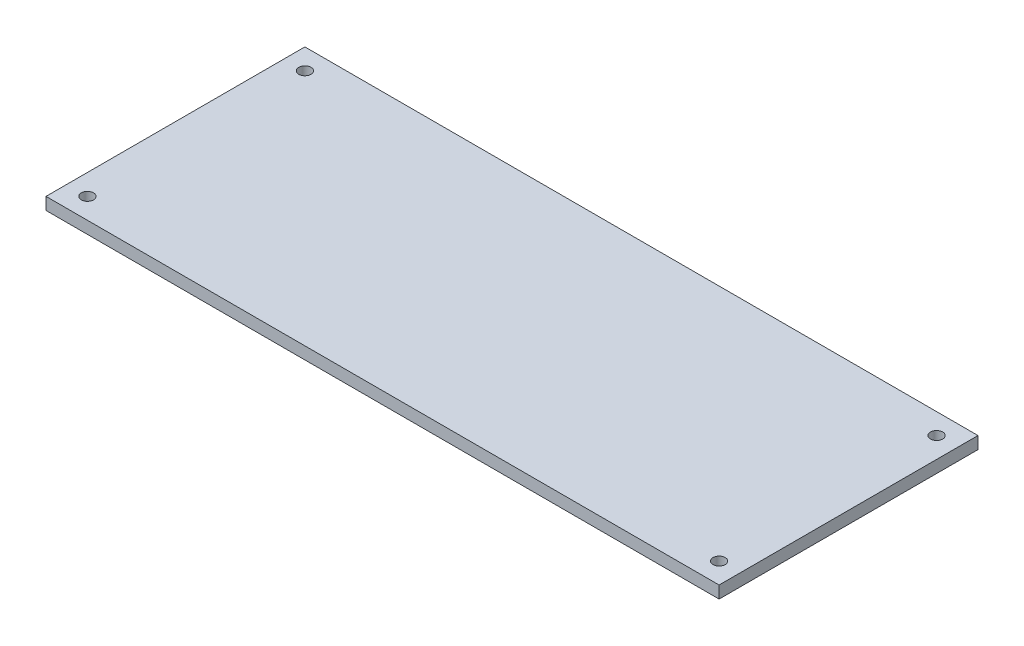
ISO-10303-21;
HEADER;
FILE_DESCRIPTION(('STEP AP214'),'2;1');
FILE_NAME('part.step','',(''),(''),'','','');
FILE_SCHEMA(('AUTOMOTIVE_DESIGN { 1 0 10303 214 1 1 1 1 }'));
ENDSEC;
DATA;
#1=APPLICATION_CONTEXT('core data for automotive mechanical design processes');
#2=APPLICATION_PROTOCOL_DEFINITION('international standard','automotive_design',2000,#1);
#3=PRODUCT_CONTEXT('',#1,'mechanical');
#4=PRODUCT('Part','Part','',(#3));
#5=PRODUCT_RELATED_PRODUCT_CATEGORY('part','',(#4));
#6=PRODUCT_DEFINITION_FORMATION('','',#4);
#7=PRODUCT_DEFINITION_CONTEXT('part definition',#1,'design');
#8=PRODUCT_DEFINITION('design','',#6,#7);
#9=PRODUCT_DEFINITION_SHAPE('','',#8);
#10=(LENGTH_UNIT() NAMED_UNIT(*) SI_UNIT(.MILLI.,.METRE.));
#11=(NAMED_UNIT(*) PLANE_ANGLE_UNIT() SI_UNIT($,.RADIAN.));
#12=(NAMED_UNIT(*) SI_UNIT($,.STERADIAN.) SOLID_ANGLE_UNIT());
#13=UNCERTAINTY_MEASURE_WITH_UNIT(LENGTH_MEASURE(1.E-05),#10,'distance_accuracy_value','');
#14=(GEOMETRIC_REPRESENTATION_CONTEXT(3) GLOBAL_UNCERTAINTY_ASSIGNED_CONTEXT((#13)) GLOBAL_UNIT_ASSIGNED_CONTEXT((#10,
#11,#12)) REPRESENTATION_CONTEXT('',''));
#15=CARTESIAN_POINT('',(0.,0.,0.));
#16=DIRECTION('',(0.,0.,1.));
#17=DIRECTION('',(1.,0.,0.));
#18=AXIS2_PLACEMENT_3D('',#15,#16,#17);
#19=CARTESIAN_POINT('',(-82.55,3.,31.75));
#20=DIRECTION('',(1.,0.,0.));
#21=DIRECTION('',(0.,0.,-1.));
#22=AXIS2_PLACEMENT_3D('',#19,#20,#21);
#23=PLANE('',#22);
#24=DIRECTION('',(0.,0.,1.));
#25=VECTOR('',#24,1.);
#26=CARTESIAN_POINT('',(-82.55,0.,31.75));
#27=LINE('',#26,#25);
#28=CARTESIAN_POINT('',(-82.55,0.,-31.75));
#29=VERTEX_POINT('',#28);
#30=CARTESIAN_POINT('',(-82.55,0.,31.75));
#31=VERTEX_POINT('',#30);
#32=EDGE_CURVE('E99',#29,#31,#27,.T.);
#33=ORIENTED_EDGE('',*,*,#32,.T.);
#34=DIRECTION('',(0.,-1.,0.));
#35=VECTOR('',#34,1.);
#36=CARTESIAN_POINT('',(-82.55,3.,31.75));
#37=LINE('',#36,#35);
#38=CARTESIAN_POINT('',(-82.55,3.,31.75));
#39=VERTEX_POINT('',#38);
#40=EDGE_CURVE('E11',#39,#31,#37,.T.);
#41=ORIENTED_EDGE('',*,*,#40,.F.);
#42=DIRECTION('',(0.,0.,1.));
#43=VECTOR('',#42,1.);
#44=CARTESIAN_POINT('',(-82.55,3.,31.75));
#45=LINE('',#44,#43);
#46=CARTESIAN_POINT('',(-82.55,3.,-31.75));
#47=VERTEX_POINT('',#46);
#48=EDGE_CURVE('E87',#47,#39,#45,.T.);
#49=ORIENTED_EDGE('',*,*,#48,.F.);
#50=DIRECTION('',(0.,-1.,0.));
#51=VECTOR('',#50,1.);
#52=CARTESIAN_POINT('',(-82.55,3.,-31.75));
#53=LINE('',#52,#51);
#54=EDGE_CURVE('E95',#47,#29,#53,.T.);
#55=ORIENTED_EDGE('',*,*,#54,.T.);
#56=EDGE_LOOP('',(#33,#41,#49,#55));
#57=FACE_BOUND('',#56,.T.);
#58=ADVANCED_FACE('F36',(#57),#23,.F.);
#59=CARTESIAN_POINT('',(-82.55,3.,31.75));
#60=DIRECTION('',(0.,0.,-1.));
#61=DIRECTION('',(-1.,0.,0.));
#62=AXIS2_PLACEMENT_3D('',#59,#60,#61);
#63=PLANE('',#62);
#64=DIRECTION('',(1.,0.,0.));
#65=VECTOR('',#64,1.);
#66=CARTESIAN_POINT('',(-82.55,0.,31.75));
#67=LINE('',#66,#65);
#68=CARTESIAN_POINT('',(82.55,0.,31.75));
#69=VERTEX_POINT('',#68);
#70=EDGE_CURVE('E91',#31,#69,#67,.T.);
#71=ORIENTED_EDGE('',*,*,#70,.T.);
#72=DIRECTION('',(0.,-1.,0.));
#73=VECTOR('',#72,1.);
#74=CARTESIAN_POINT('',(82.55,3.,31.75));
#75=LINE('',#74,#73);
#76=CARTESIAN_POINT('',(82.55,3.,31.75));
#77=VERTEX_POINT('',#76);
#78=EDGE_CURVE('E44',#77,#69,#75,.T.);
#79=ORIENTED_EDGE('',*,*,#78,.F.);
#80=DIRECTION('',(1.,0.,0.));
#81=VECTOR('',#80,1.);
#82=CARTESIAN_POINT('',(-82.55,3.,31.75));
#83=LINE('',#82,#81);
#84=EDGE_CURVE('E82',#39,#77,#83,.T.);
#85=ORIENTED_EDGE('',*,*,#84,.F.);
#86=ORIENTED_EDGE('',*,*,#40,.T.);
#87=EDGE_LOOP('',(#71,#79,#85,#86));
#88=FACE_BOUND('',#87,.T.);
#89=ADVANCED_FACE('F90',(#88),#63,.F.);
#90=CARTESIAN_POINT('',(82.55,3.,31.75));
#91=DIRECTION('',(-1.,0.,0.));
#92=DIRECTION('',(0.,0.,1.));
#93=AXIS2_PLACEMENT_3D('',#90,#91,#92);
#94=PLANE('',#93);
#95=DIRECTION('',(0.,0.,-1.));
#96=VECTOR('',#95,1.);
#97=CARTESIAN_POINT('',(82.55,0.,31.75));
#98=LINE('',#97,#96);
#99=CARTESIAN_POINT('',(82.55,0.,-31.75));
#100=VERTEX_POINT('',#99);
#101=EDGE_CURVE('E69',#69,#100,#98,.T.);
#102=ORIENTED_EDGE('',*,*,#101,.T.);
#103=DIRECTION('',(0.,-1.,0.));
#104=VECTOR('',#103,1.);
#105=CARTESIAN_POINT('',(82.55,3.,-31.75));
#106=LINE('',#105,#104);
#107=CARTESIAN_POINT('',(82.55,3.,-31.75));
#108=VERTEX_POINT('',#107);
#109=EDGE_CURVE('E92',#108,#100,#106,.T.);
#110=ORIENTED_EDGE('',*,*,#109,.F.);
#111=DIRECTION('',(0.,0.,-1.));
#112=VECTOR('',#111,1.);
#113=CARTESIAN_POINT('',(82.55,3.,31.75));
#114=LINE('',#113,#112);
#115=EDGE_CURVE('E85',#77,#108,#114,.T.);
#116=ORIENTED_EDGE('',*,*,#115,.F.);
#117=ORIENTED_EDGE('',*,*,#78,.T.);
#118=EDGE_LOOP('',(#102,#110,#116,#117));
#119=FACE_BOUND('',#118,.T.);
#120=ADVANCED_FACE('F93',(#119),#94,.F.);
#121=CARTESIAN_POINT('',(-82.55,3.,-31.75));
#122=DIRECTION('',(0.,0.,1.));
#123=DIRECTION('',(1.,0.,0.));
#124=AXIS2_PLACEMENT_3D('',#121,#122,#123);
#125=PLANE('',#124);
#126=DIRECTION('',(-1.,0.,0.));
#127=VECTOR('',#126,1.);
#128=CARTESIAN_POINT('',(-82.55,0.,-31.75));
#129=LINE('',#128,#127);
#130=EDGE_CURVE('E75',#100,#29,#129,.T.);
#131=ORIENTED_EDGE('',*,*,#130,.T.);
#132=ORIENTED_EDGE('',*,*,#54,.F.);
#133=DIRECTION('',(-1.,0.,0.));
#134=VECTOR('',#133,1.);
#135=CARTESIAN_POINT('',(-82.55,3.,-31.75));
#136=LINE('',#135,#134);
#137=EDGE_CURVE('E52',#108,#47,#136,.T.);
#138=ORIENTED_EDGE('',*,*,#137,.F.);
#139=ORIENTED_EDGE('',*,*,#109,.T.);
#140=EDGE_LOOP('',(#131,#132,#138,#139));
#141=FACE_BOUND('',#140,.T.);
#142=ADVANCED_FACE('F107',(#141),#125,.F.);
#143=CARTESIAN_POINT('',(0.,3.,0.));
#144=DIRECTION('',(0.,-1.,0.));
#145=DIRECTION('',(0.,0.,-1.));
#146=AXIS2_PLACEMENT_3D('',#143,#144,#145);
#147=PLANE('',#146);
#148=CARTESIAN_POINT('',(-77.47,3.,26.67));
#149=DIRECTION('',(0.,1.,0.));
#150=DIRECTION('',(0.,0.,1.));
#151=AXIS2_PLACEMENT_3D('',#148,#149,#150);
#152=CIRCLE('',#151,1.5);
#153=CARTESIAN_POINT('',(-77.47,3.,28.17));
#154=VERTEX_POINT('',#153);
#155=EDGE_CURVE('E116',#154,#154,#152,.T.);
#156=ORIENTED_EDGE('',*,*,#155,.F.);
#157=EDGE_LOOP('',(#156));
#158=FACE_BOUND('',#157,.T.);
#159=CARTESIAN_POINT('',(77.47,3.,-26.67));
#160=DIRECTION('',(0.,1.,0.));
#161=DIRECTION('',(0.,0.,1.));
#162=AXIS2_PLACEMENT_3D('',#159,#160,#161);
#163=CIRCLE('',#162,1.5);
#164=CARTESIAN_POINT('',(77.47,3.,-25.17));
#165=VERTEX_POINT('',#164);
#166=EDGE_CURVE('E122',#165,#165,#163,.T.);
#167=ORIENTED_EDGE('',*,*,#166,.F.);
#168=EDGE_LOOP('',(#167));
#169=FACE_BOUND('',#168,.T.);
#170=CARTESIAN_POINT('',(77.47,3.,26.67));
#171=DIRECTION('',(0.,1.,0.));
#172=DIRECTION('',(0.,0.,1.));
#173=AXIS2_PLACEMENT_3D('',#170,#171,#172);
#174=CIRCLE('',#173,1.5);
#175=CARTESIAN_POINT('',(77.47,3.,28.17));
#176=VERTEX_POINT('',#175);
#177=EDGE_CURVE('E123',#176,#176,#174,.T.);
#178=ORIENTED_EDGE('',*,*,#177,.F.);
#179=EDGE_LOOP('',(#178));
#180=FACE_BOUND('',#179,.T.);
#181=CARTESIAN_POINT('',(-77.47,3.,-26.67));
#182=DIRECTION('',(0.,1.,0.));
#183=DIRECTION('',(0.,0.,1.));
#184=AXIS2_PLACEMENT_3D('',#181,#182,#183);
#185=CIRCLE('',#184,1.5);
#186=CARTESIAN_POINT('',(-77.47,3.,-25.17));
#187=VERTEX_POINT('',#186);
#188=EDGE_CURVE('E102',#187,#187,#185,.T.);
#189=ORIENTED_EDGE('',*,*,#188,.F.);
#190=EDGE_LOOP('',(#189));
#191=FACE_BOUND('',#190,.T.);
#192=ORIENTED_EDGE('',*,*,#48,.T.);
#193=ORIENTED_EDGE('',*,*,#84,.T.);
#194=ORIENTED_EDGE('',*,*,#115,.T.);
#195=ORIENTED_EDGE('',*,*,#137,.T.);
#196=EDGE_LOOP('',(#192,#193,#194,#195));
#197=FACE_BOUND('',#196,.T.);
#198=ADVANCED_FACE('F83',(#158,#169,#180,#191,#197),#147,.F.);
#199=CARTESIAN_POINT('',(0.,0.,0.));
#200=DIRECTION('',(0.,-1.,0.));
#201=DIRECTION('',(0.,0.,-1.));
#202=AXIS2_PLACEMENT_3D('',#199,#200,#201);
#203=PLANE('',#202);
#204=CARTESIAN_POINT('',(-77.47,0.,26.67));
#205=DIRECTION('',(0.,-1.,0.));
#206=DIRECTION('',(0.,0.,-1.));
#207=AXIS2_PLACEMENT_3D('',#204,#205,#206);
#208=CIRCLE('',#207,1.5);
#209=CARTESIAN_POINT('',(-77.47,0.,28.17));
#210=VERTEX_POINT('',#209);
#211=EDGE_CURVE('E126',#210,#210,#208,.F.);
#212=ORIENTED_EDGE('',*,*,#211,.T.);
#213=EDGE_LOOP('',(#212));
#214=FACE_BOUND('',#213,.T.);
#215=CARTESIAN_POINT('',(77.47,0.,-26.67));
#216=DIRECTION('',(0.,-1.,0.));
#217=DIRECTION('',(0.,0.,-1.));
#218=AXIS2_PLACEMENT_3D('',#215,#216,#217);
#219=CIRCLE('',#218,1.5);
#220=CARTESIAN_POINT('',(77.47,0.,-25.17));
#221=VERTEX_POINT('',#220);
#222=EDGE_CURVE('E119',#221,#221,#219,.F.);
#223=ORIENTED_EDGE('',*,*,#222,.T.);
#224=EDGE_LOOP('',(#223));
#225=FACE_BOUND('',#224,.T.);
#226=CARTESIAN_POINT('',(77.47,0.,26.67));
#227=DIRECTION('',(0.,-1.,0.));
#228=DIRECTION('',(0.,0.,-1.));
#229=AXIS2_PLACEMENT_3D('',#226,#227,#228);
#230=CIRCLE('',#229,1.5);
#231=CARTESIAN_POINT('',(77.47,0.,28.17));
#232=VERTEX_POINT('',#231);
#233=EDGE_CURVE('E131',#232,#232,#230,.F.);
#234=ORIENTED_EDGE('',*,*,#233,.T.);
#235=EDGE_LOOP('',(#234));
#236=FACE_BOUND('',#235,.T.);
#237=CARTESIAN_POINT('',(-77.47,0.,-26.67));
#238=DIRECTION('',(0.,-1.,0.));
#239=DIRECTION('',(0.,0.,-1.));
#240=AXIS2_PLACEMENT_3D('',#237,#238,#239);
#241=CIRCLE('',#240,1.5);
#242=CARTESIAN_POINT('',(-77.47,0.,-25.17));
#243=VERTEX_POINT('',#242);
#244=EDGE_CURVE('E113',#243,#243,#241,.F.);
#245=ORIENTED_EDGE('',*,*,#244,.T.);
#246=EDGE_LOOP('',(#245));
#247=FACE_BOUND('',#246,.T.);
#248=ORIENTED_EDGE('',*,*,#32,.F.);
#249=ORIENTED_EDGE('',*,*,#130,.F.);
#250=ORIENTED_EDGE('',*,*,#101,.F.);
#251=ORIENTED_EDGE('',*,*,#70,.F.);
#252=EDGE_LOOP('',(#248,#249,#250,#251));
#253=FACE_BOUND('',#252,.T.);
#254=ADVANCED_FACE('F110',(#214,#225,#236,#247,#253),#203,.T.);
#255=CARTESIAN_POINT('',(-77.47,-0.00100000000000013,-26.67));
#256=DIRECTION('',(0.,1.,0.));
#257=DIRECTION('',(0.,0.,1.));
#258=AXIS2_PLACEMENT_3D('',#255,#256,#257);
#259=CYLINDRICAL_SURFACE('',#258,1.5);
#260=CARTESIAN_POINT('',(-77.47,0.,-25.17));
#261=CARTESIAN_POINT('',(-77.47,0.03125,-25.17));
#262=CARTESIAN_POINT('',(-77.47,0.0625,-25.17));
#263=CARTESIAN_POINT('',(-77.47,0.125,-25.17));
#264=CARTESIAN_POINT('',(-77.47,0.15625,-25.17));
#265=CARTESIAN_POINT('',(-77.47,0.21875,-25.17));
#266=CARTESIAN_POINT('',(-77.47,0.25,-25.17));
#267=CARTESIAN_POINT('',(-77.47,0.3125,-25.17));
#268=CARTESIAN_POINT('',(-77.47,0.34375,-25.17));
#269=CARTESIAN_POINT('',(-77.47,0.40625,-25.17));
#270=CARTESIAN_POINT('',(-77.47,0.4375,-25.17));
#271=CARTESIAN_POINT('',(-77.47,0.5,-25.17));
#272=CARTESIAN_POINT('',(-77.47,0.53125,-25.17));
#273=CARTESIAN_POINT('',(-77.47,0.59375,-25.17));
#274=CARTESIAN_POINT('',(-77.47,0.625,-25.17));
#275=CARTESIAN_POINT('',(-77.47,0.6875,-25.17));
#276=CARTESIAN_POINT('',(-77.47,0.71875,-25.17));
#277=CARTESIAN_POINT('',(-77.47,0.78125,-25.17));
#278=CARTESIAN_POINT('',(-77.47,0.8125,-25.17));
#279=CARTESIAN_POINT('',(-77.47,0.875,-25.17));
#280=CARTESIAN_POINT('',(-77.47,0.90625,-25.17));
#281=CARTESIAN_POINT('',(-77.47,0.96875,-25.17));
#282=CARTESIAN_POINT('',(-77.47,1.,-25.17));
#283=CARTESIAN_POINT('',(-77.47,1.0625,-25.17));
#284=CARTESIAN_POINT('',(-77.47,1.09375,-25.17));
#285=CARTESIAN_POINT('',(-77.47,1.15625,-25.17));
#286=CARTESIAN_POINT('',(-77.47,1.1875,-25.17));
#287=CARTESIAN_POINT('',(-77.47,1.25,-25.17));
#288=CARTESIAN_POINT('',(-77.47,1.28125,-25.17));
#289=CARTESIAN_POINT('',(-77.47,1.34375,-25.17));
#290=CARTESIAN_POINT('',(-77.47,1.375,-25.17));
#291=CARTESIAN_POINT('',(-77.47,1.4375,-25.17));
#292=CARTESIAN_POINT('',(-77.47,1.46875,-25.17));
#293=CARTESIAN_POINT('',(-77.47,1.53125,-25.17));
#294=CARTESIAN_POINT('',(-77.47,1.5625,-25.17));
#295=CARTESIAN_POINT('',(-77.47,1.625,-25.17));
#296=CARTESIAN_POINT('',(-77.47,1.65625,-25.17));
#297=CARTESIAN_POINT('',(-77.47,1.71875,-25.17));
#298=CARTESIAN_POINT('',(-77.47,1.75,-25.17));
#299=CARTESIAN_POINT('',(-77.47,1.8125,-25.17));
#300=CARTESIAN_POINT('',(-77.47,1.84375,-25.17));
#301=CARTESIAN_POINT('',(-77.47,1.90625,-25.17));
#302=CARTESIAN_POINT('',(-77.47,1.9375,-25.17));
#303=CARTESIAN_POINT('',(-77.47,2.,-25.17));
#304=CARTESIAN_POINT('',(-77.47,2.03125,-25.17));
#305=CARTESIAN_POINT('',(-77.47,2.09375,-25.17));
#306=CARTESIAN_POINT('',(-77.47,2.125,-25.17));
#307=CARTESIAN_POINT('',(-77.47,2.1875,-25.17));
#308=CARTESIAN_POINT('',(-77.47,2.21875,-25.17));
#309=CARTESIAN_POINT('',(-77.47,2.28125,-25.17));
#310=CARTESIAN_POINT('',(-77.47,2.3125,-25.17));
#311=CARTESIAN_POINT('',(-77.47,2.375,-25.17));
#312=CARTESIAN_POINT('',(-77.47,2.40625,-25.17));
#313=CARTESIAN_POINT('',(-77.47,2.46875,-25.17));
#314=CARTESIAN_POINT('',(-77.47,2.5,-25.17));
#315=CARTESIAN_POINT('',(-77.47,2.5625,-25.17));
#316=CARTESIAN_POINT('',(-77.47,2.59375,-25.17));
#317=CARTESIAN_POINT('',(-77.47,2.65625,-25.17));
#318=CARTESIAN_POINT('',(-77.47,2.6875,-25.17));
#319=CARTESIAN_POINT('',(-77.47,2.75,-25.17));
#320=CARTESIAN_POINT('',(-77.47,2.78125,-25.17));
#321=CARTESIAN_POINT('',(-77.47,2.84375,-25.17));
#322=CARTESIAN_POINT('',(-77.47,2.875,-25.17));
#323=CARTESIAN_POINT('',(-77.47,2.9375,-25.17));
#324=CARTESIAN_POINT('',(-77.47,2.96875,-25.17));
#325=CARTESIAN_POINT('',(-77.47,3.,-25.17));
#326=B_SPLINE_CURVE_WITH_KNOTS('',3,(#260,#261,#262,#263,#264,#265,#266,#267,#268,#269,#270,
#271,#272,#273,#274,#275,#276,#277,#278,#279,#280,#281,#282,#283,#284,#285,#286,#287,#288,#289,
#290,#291,#292,#293,#294,#295,#296,#297,#298,#299,#300,#301,#302,#303,#304,#305,#306,#307,#308,
#309,#310,#311,#312,#313,#314,#315,#316,#317,#318,#319,#320,#321,#322,#323,#324,#325),
.UNSPECIFIED.,.F.,.F.,(4,2,2,2,2,2,2,2,2,2,2,2,2,2,2,2,2,2,2,2,2,2,2,2,2,2,2,2,2,2,2,2,4),(0.,
0.09375,0.1875,0.28125,0.375,0.46875,0.5625,0.65625,0.75,0.84375,0.9375,1.03125,1.125,1.21875,
1.3125,1.40625,1.5,1.59375,1.6875,1.78125,1.875,1.96875,2.0625,2.15625,2.25,2.34375,2.4375,
2.53125,2.625,2.71875,2.8125,2.90625,3.),.UNSPECIFIED.);
#327=EDGE_CURVE('BSEAM145',#243,#187,#326,.T.);
#328=ORIENTED_EDGE('',*,*,#244,.F.);
#329=ORIENTED_EDGE('',*,*,#188,.T.);
#330=ORIENTED_EDGE('',*,*,#327,.T.);
#331=ORIENTED_EDGE('',*,*,#327,.F.);
#332=EDGE_LOOP('',(#328,#330,#329,#331));
#333=FACE_BOUND('',#332,.T.);
#334=ADVANCED_FACE('F145',(#333),#259,.F.);
#335=CARTESIAN_POINT('',(77.47,-0.00100000000000013,26.67));
#336=DIRECTION('',(0.,1.,0.));
#337=DIRECTION('',(0.,0.,1.));
#338=AXIS2_PLACEMENT_3D('',#335,#336,#337);
#339=CYLINDRICAL_SURFACE('',#338,1.5);
#340=CARTESIAN_POINT('',(77.47,0.,28.17));
#341=CARTESIAN_POINT('',(77.47,0.03125,28.17));
#342=CARTESIAN_POINT('',(77.47,0.0625,28.17));
#343=CARTESIAN_POINT('',(77.47,0.125,28.17));
#344=CARTESIAN_POINT('',(77.47,0.15625,28.17));
#345=CARTESIAN_POINT('',(77.47,0.21875,28.17));
#346=CARTESIAN_POINT('',(77.47,0.25,28.17));
#347=CARTESIAN_POINT('',(77.47,0.3125,28.17));
#348=CARTESIAN_POINT('',(77.47,0.34375,28.17));
#349=CARTESIAN_POINT('',(77.47,0.40625,28.17));
#350=CARTESIAN_POINT('',(77.47,0.4375,28.17));
#351=CARTESIAN_POINT('',(77.47,0.5,28.17));
#352=CARTESIAN_POINT('',(77.47,0.53125,28.17));
#353=CARTESIAN_POINT('',(77.47,0.59375,28.17));
#354=CARTESIAN_POINT('',(77.47,0.625,28.17));
#355=CARTESIAN_POINT('',(77.47,0.6875,28.17));
#356=CARTESIAN_POINT('',(77.47,0.71875,28.17));
#357=CARTESIAN_POINT('',(77.47,0.78125,28.17));
#358=CARTESIAN_POINT('',(77.47,0.8125,28.17));
#359=CARTESIAN_POINT('',(77.47,0.875,28.17));
#360=CARTESIAN_POINT('',(77.47,0.90625,28.17));
#361=CARTESIAN_POINT('',(77.47,0.96875,28.17));
#362=CARTESIAN_POINT('',(77.47,1.,28.17));
#363=CARTESIAN_POINT('',(77.47,1.0625,28.17));
#364=CARTESIAN_POINT('',(77.47,1.09375,28.17));
#365=CARTESIAN_POINT('',(77.47,1.15625,28.17));
#366=CARTESIAN_POINT('',(77.47,1.1875,28.17));
#367=CARTESIAN_POINT('',(77.47,1.25,28.17));
#368=CARTESIAN_POINT('',(77.47,1.28125,28.17));
#369=CARTESIAN_POINT('',(77.47,1.34375,28.17));
#370=CARTESIAN_POINT('',(77.47,1.375,28.17));
#371=CARTESIAN_POINT('',(77.47,1.4375,28.17));
#372=CARTESIAN_POINT('',(77.47,1.46875,28.17));
#373=CARTESIAN_POINT('',(77.47,1.53125,28.17));
#374=CARTESIAN_POINT('',(77.47,1.5625,28.17));
#375=CARTESIAN_POINT('',(77.47,1.625,28.17));
#376=CARTESIAN_POINT('',(77.47,1.65625,28.17));
#377=CARTESIAN_POINT('',(77.47,1.71875,28.17));
#378=CARTESIAN_POINT('',(77.47,1.75,28.17));
#379=CARTESIAN_POINT('',(77.47,1.8125,28.17));
#380=CARTESIAN_POINT('',(77.47,1.84375,28.17));
#381=CARTESIAN_POINT('',(77.47,1.90625,28.17));
#382=CARTESIAN_POINT('',(77.47,1.9375,28.17));
#383=CARTESIAN_POINT('',(77.47,2.,28.17));
#384=CARTESIAN_POINT('',(77.47,2.03125,28.17));
#385=CARTESIAN_POINT('',(77.47,2.09375,28.17));
#386=CARTESIAN_POINT('',(77.47,2.125,28.17));
#387=CARTESIAN_POINT('',(77.47,2.1875,28.17));
#388=CARTESIAN_POINT('',(77.47,2.21875,28.17));
#389=CARTESIAN_POINT('',(77.47,2.28125,28.17));
#390=CARTESIAN_POINT('',(77.47,2.3125,28.17));
#391=CARTESIAN_POINT('',(77.47,2.375,28.17));
#392=CARTESIAN_POINT('',(77.47,2.40625,28.17));
#393=CARTESIAN_POINT('',(77.47,2.46875,28.17));
#394=CARTESIAN_POINT('',(77.47,2.5,28.17));
#395=CARTESIAN_POINT('',(77.47,2.5625,28.17));
#396=CARTESIAN_POINT('',(77.47,2.59375,28.17));
#397=CARTESIAN_POINT('',(77.47,2.65625,28.17));
#398=CARTESIAN_POINT('',(77.47,2.6875,28.17));
#399=CARTESIAN_POINT('',(77.47,2.75,28.17));
#400=CARTESIAN_POINT('',(77.47,2.78125,28.17));
#401=CARTESIAN_POINT('',(77.47,2.84375,28.17));
#402=CARTESIAN_POINT('',(77.47,2.875,28.17));
#403=CARTESIAN_POINT('',(77.47,2.9375,28.17));
#404=CARTESIAN_POINT('',(77.47,2.96875,28.17));
#405=CARTESIAN_POINT('',(77.47,3.,28.17));
#406=B_SPLINE_CURVE_WITH_KNOTS('',3,(#340,#341,#342,#343,#344,#345,#346,#347,#348,#349,#350,
#351,#352,#353,#354,#355,#356,#357,#358,#359,#360,#361,#362,#363,#364,#365,#366,#367,#368,#369,
#370,#371,#372,#373,#374,#375,#376,#377,#378,#379,#380,#381,#382,#383,#384,#385,#386,#387,#388,
#389,#390,#391,#392,#393,#394,#395,#396,#397,#398,#399,#400,#401,#402,#403,#404,#405),
.UNSPECIFIED.,.F.,.F.,(4,2,2,2,2,2,2,2,2,2,2,2,2,2,2,2,2,2,2,2,2,2,2,2,2,2,2,2,2,2,2,2,4),(0.,
0.09375,0.1875,0.28125,0.375,0.46875,0.5625,0.65625,0.75,0.84375,0.9375,1.03125,1.125,1.21875,
1.3125,1.40625,1.5,1.59375,1.6875,1.78125,1.875,1.96875,2.0625,2.15625,2.25,2.34375,2.4375,
2.53125,2.625,2.71875,2.8125,2.90625,3.),.UNSPECIFIED.);
#407=EDGE_CURVE('BSEAM137',#232,#176,#406,.T.);
#408=ORIENTED_EDGE('',*,*,#233,.F.);
#409=ORIENTED_EDGE('',*,*,#177,.T.);
#410=ORIENTED_EDGE('',*,*,#407,.T.);
#411=ORIENTED_EDGE('',*,*,#407,.F.);
#412=EDGE_LOOP('',(#408,#410,#409,#411));
#413=FACE_BOUND('',#412,.T.);
#414=ADVANCED_FACE('F137',(#413),#339,.F.);
#415=CARTESIAN_POINT('',(77.47,-0.00100000000000013,-26.67));
#416=DIRECTION('',(0.,1.,0.));
#417=DIRECTION('',(0.,0.,1.));
#418=AXIS2_PLACEMENT_3D('',#415,#416,#417);
#419=CYLINDRICAL_SURFACE('',#418,1.5);
#420=CARTESIAN_POINT('',(77.47,0.,-25.17));
#421=CARTESIAN_POINT('',(77.47,0.03125,-25.17));
#422=CARTESIAN_POINT('',(77.47,0.0625,-25.17));
#423=CARTESIAN_POINT('',(77.47,0.125,-25.17));
#424=CARTESIAN_POINT('',(77.47,0.15625,-25.17));
#425=CARTESIAN_POINT('',(77.47,0.21875,-25.17));
#426=CARTESIAN_POINT('',(77.47,0.25,-25.17));
#427=CARTESIAN_POINT('',(77.47,0.3125,-25.17));
#428=CARTESIAN_POINT('',(77.47,0.34375,-25.17));
#429=CARTESIAN_POINT('',(77.47,0.40625,-25.17));
#430=CARTESIAN_POINT('',(77.47,0.4375,-25.17));
#431=CARTESIAN_POINT('',(77.47,0.5,-25.17));
#432=CARTESIAN_POINT('',(77.47,0.53125,-25.17));
#433=CARTESIAN_POINT('',(77.47,0.59375,-25.17));
#434=CARTESIAN_POINT('',(77.47,0.625,-25.17));
#435=CARTESIAN_POINT('',(77.47,0.6875,-25.17));
#436=CARTESIAN_POINT('',(77.47,0.71875,-25.17));
#437=CARTESIAN_POINT('',(77.47,0.78125,-25.17));
#438=CARTESIAN_POINT('',(77.47,0.8125,-25.17));
#439=CARTESIAN_POINT('',(77.47,0.875,-25.17));
#440=CARTESIAN_POINT('',(77.47,0.90625,-25.17));
#441=CARTESIAN_POINT('',(77.47,0.96875,-25.17));
#442=CARTESIAN_POINT('',(77.47,1.,-25.17));
#443=CARTESIAN_POINT('',(77.47,1.0625,-25.17));
#444=CARTESIAN_POINT('',(77.47,1.09375,-25.17));
#445=CARTESIAN_POINT('',(77.47,1.15625,-25.17));
#446=CARTESIAN_POINT('',(77.47,1.1875,-25.17));
#447=CARTESIAN_POINT('',(77.47,1.25,-25.17));
#448=CARTESIAN_POINT('',(77.47,1.28125,-25.17));
#449=CARTESIAN_POINT('',(77.47,1.34375,-25.17));
#450=CARTESIAN_POINT('',(77.47,1.375,-25.17));
#451=CARTESIAN_POINT('',(77.47,1.4375,-25.17));
#452=CARTESIAN_POINT('',(77.47,1.46875,-25.17));
#453=CARTESIAN_POINT('',(77.47,1.53125,-25.17));
#454=CARTESIAN_POINT('',(77.47,1.5625,-25.17));
#455=CARTESIAN_POINT('',(77.47,1.625,-25.17));
#456=CARTESIAN_POINT('',(77.47,1.65625,-25.17));
#457=CARTESIAN_POINT('',(77.47,1.71875,-25.17));
#458=CARTESIAN_POINT('',(77.47,1.75,-25.17));
#459=CARTESIAN_POINT('',(77.47,1.8125,-25.17));
#460=CARTESIAN_POINT('',(77.47,1.84375,-25.17));
#461=CARTESIAN_POINT('',(77.47,1.90625,-25.17));
#462=CARTESIAN_POINT('',(77.47,1.9375,-25.17));
#463=CARTESIAN_POINT('',(77.47,2.,-25.17));
#464=CARTESIAN_POINT('',(77.47,2.03125,-25.17));
#465=CARTESIAN_POINT('',(77.47,2.09375,-25.17));
#466=CARTESIAN_POINT('',(77.47,2.125,-25.17));
#467=CARTESIAN_POINT('',(77.47,2.1875,-25.17));
#468=CARTESIAN_POINT('',(77.47,2.21875,-25.17));
#469=CARTESIAN_POINT('',(77.47,2.28125,-25.17));
#470=CARTESIAN_POINT('',(77.47,2.3125,-25.17));
#471=CARTESIAN_POINT('',(77.47,2.375,-25.17));
#472=CARTESIAN_POINT('',(77.47,2.40625,-25.17));
#473=CARTESIAN_POINT('',(77.47,2.46875,-25.17));
#474=CARTESIAN_POINT('',(77.47,2.5,-25.17));
#475=CARTESIAN_POINT('',(77.47,2.5625,-25.17));
#476=CARTESIAN_POINT('',(77.47,2.59375,-25.17));
#477=CARTESIAN_POINT('',(77.47,2.65625,-25.17));
#478=CARTESIAN_POINT('',(77.47,2.6875,-25.17));
#479=CARTESIAN_POINT('',(77.47,2.75,-25.17));
#480=CARTESIAN_POINT('',(77.47,2.78125,-25.17));
#481=CARTESIAN_POINT('',(77.47,2.84375,-25.17));
#482=CARTESIAN_POINT('',(77.47,2.875,-25.17));
#483=CARTESIAN_POINT('',(77.47,2.9375,-25.17));
#484=CARTESIAN_POINT('',(77.47,2.96875,-25.17));
#485=CARTESIAN_POINT('',(77.47,3.,-25.17));
#486=B_SPLINE_CURVE_WITH_KNOTS('',3,(#420,#421,#422,#423,#424,#425,#426,#427,#428,#429,#430,
#431,#432,#433,#434,#435,#436,#437,#438,#439,#440,#441,#442,#443,#444,#445,#446,#447,#448,#449,
#450,#451,#452,#453,#454,#455,#456,#457,#458,#459,#460,#461,#462,#463,#464,#465,#466,#467,#468,
#469,#470,#471,#472,#473,#474,#475,#476,#477,#478,#479,#480,#481,#482,#483,#484,#485),
.UNSPECIFIED.,.F.,.F.,(4,2,2,2,2,2,2,2,2,2,2,2,2,2,2,2,2,2,2,2,2,2,2,2,2,2,2,2,2,2,2,2,4),(0.,
0.09375,0.1875,0.28125,0.375,0.46875,0.5625,0.65625,0.75,0.84375,0.9375,1.03125,1.125,1.21875,
1.3125,1.40625,1.5,1.59375,1.6875,1.78125,1.875,1.96875,2.0625,2.15625,2.25,2.34375,2.4375,
2.53125,2.625,2.71875,2.8125,2.90625,3.),.UNSPECIFIED.);
#487=EDGE_CURVE('BSEAM153',#221,#165,#486,.T.);
#488=ORIENTED_EDGE('',*,*,#222,.F.);
#489=ORIENTED_EDGE('',*,*,#166,.T.);
#490=ORIENTED_EDGE('',*,*,#487,.T.);
#491=ORIENTED_EDGE('',*,*,#487,.F.);
#492=EDGE_LOOP('',(#488,#490,#489,#491));
#493=FACE_BOUND('',#492,.T.);
#494=ADVANCED_FACE('F153',(#493),#419,.F.);
#495=CARTESIAN_POINT('',(-77.47,-0.00100000000000013,26.67));
#496=DIRECTION('',(0.,1.,0.));
#497=DIRECTION('',(0.,0.,1.));
#498=AXIS2_PLACEMENT_3D('',#495,#496,#497);
#499=CYLINDRICAL_SURFACE('',#498,1.5);
#500=CARTESIAN_POINT('',(-77.47,0.,28.17));
#501=CARTESIAN_POINT('',(-77.47,0.03125,28.17));
#502=CARTESIAN_POINT('',(-77.47,0.0625,28.17));
#503=CARTESIAN_POINT('',(-77.47,0.125,28.17));
#504=CARTESIAN_POINT('',(-77.47,0.15625,28.17));
#505=CARTESIAN_POINT('',(-77.47,0.21875,28.17));
#506=CARTESIAN_POINT('',(-77.47,0.25,28.17));
#507=CARTESIAN_POINT('',(-77.47,0.3125,28.17));
#508=CARTESIAN_POINT('',(-77.47,0.34375,28.17));
#509=CARTESIAN_POINT('',(-77.47,0.40625,28.17));
#510=CARTESIAN_POINT('',(-77.47,0.4375,28.17));
#511=CARTESIAN_POINT('',(-77.47,0.5,28.17));
#512=CARTESIAN_POINT('',(-77.47,0.53125,28.17));
#513=CARTESIAN_POINT('',(-77.47,0.59375,28.17));
#514=CARTESIAN_POINT('',(-77.47,0.625,28.17));
#515=CARTESIAN_POINT('',(-77.47,0.6875,28.17));
#516=CARTESIAN_POINT('',(-77.47,0.71875,28.17));
#517=CARTESIAN_POINT('',(-77.47,0.78125,28.17));
#518=CARTESIAN_POINT('',(-77.47,0.8125,28.17));
#519=CARTESIAN_POINT('',(-77.47,0.875,28.17));
#520=CARTESIAN_POINT('',(-77.47,0.90625,28.17));
#521=CARTESIAN_POINT('',(-77.47,0.96875,28.17));
#522=CARTESIAN_POINT('',(-77.47,1.,28.17));
#523=CARTESIAN_POINT('',(-77.47,1.0625,28.17));
#524=CARTESIAN_POINT('',(-77.47,1.09375,28.17));
#525=CARTESIAN_POINT('',(-77.47,1.15625,28.17));
#526=CARTESIAN_POINT('',(-77.47,1.1875,28.17));
#527=CARTESIAN_POINT('',(-77.47,1.25,28.17));
#528=CARTESIAN_POINT('',(-77.47,1.28125,28.17));
#529=CARTESIAN_POINT('',(-77.47,1.34375,28.17));
#530=CARTESIAN_POINT('',(-77.47,1.375,28.17));
#531=CARTESIAN_POINT('',(-77.47,1.4375,28.17));
#532=CARTESIAN_POINT('',(-77.47,1.46875,28.17));
#533=CARTESIAN_POINT('',(-77.47,1.53125,28.17));
#534=CARTESIAN_POINT('',(-77.47,1.5625,28.17));
#535=CARTESIAN_POINT('',(-77.47,1.625,28.17));
#536=CARTESIAN_POINT('',(-77.47,1.65625,28.17));
#537=CARTESIAN_POINT('',(-77.47,1.71875,28.17));
#538=CARTESIAN_POINT('',(-77.47,1.75,28.17));
#539=CARTESIAN_POINT('',(-77.47,1.8125,28.17));
#540=CARTESIAN_POINT('',(-77.47,1.84375,28.17));
#541=CARTESIAN_POINT('',(-77.47,1.90625,28.17));
#542=CARTESIAN_POINT('',(-77.47,1.9375,28.17));
#543=CARTESIAN_POINT('',(-77.47,2.,28.17));
#544=CARTESIAN_POINT('',(-77.47,2.03125,28.17));
#545=CARTESIAN_POINT('',(-77.47,2.09375,28.17));
#546=CARTESIAN_POINT('',(-77.47,2.125,28.17));
#547=CARTESIAN_POINT('',(-77.47,2.1875,28.17));
#548=CARTESIAN_POINT('',(-77.47,2.21875,28.17));
#549=CARTESIAN_POINT('',(-77.47,2.28125,28.17));
#550=CARTESIAN_POINT('',(-77.47,2.3125,28.17));
#551=CARTESIAN_POINT('',(-77.47,2.375,28.17));
#552=CARTESIAN_POINT('',(-77.47,2.40625,28.17));
#553=CARTESIAN_POINT('',(-77.47,2.46875,28.17));
#554=CARTESIAN_POINT('',(-77.47,2.5,28.17));
#555=CARTESIAN_POINT('',(-77.47,2.5625,28.17));
#556=CARTESIAN_POINT('',(-77.47,2.59375,28.17));
#557=CARTESIAN_POINT('',(-77.47,2.65625,28.17));
#558=CARTESIAN_POINT('',(-77.47,2.6875,28.17));
#559=CARTESIAN_POINT('',(-77.47,2.75,28.17));
#560=CARTESIAN_POINT('',(-77.47,2.78125,28.17));
#561=CARTESIAN_POINT('',(-77.47,2.84375,28.17));
#562=CARTESIAN_POINT('',(-77.47,2.875,28.17));
#563=CARTESIAN_POINT('',(-77.47,2.9375,28.17));
#564=CARTESIAN_POINT('',(-77.47,2.96875,28.17));
#565=CARTESIAN_POINT('',(-77.47,3.,28.17));
#566=B_SPLINE_CURVE_WITH_KNOTS('',3,(#500,#501,#502,#503,#504,#505,#506,#507,#508,#509,#510,
#511,#512,#513,#514,#515,#516,#517,#518,#519,#520,#521,#522,#523,#524,#525,#526,#527,#528,#529,
#530,#531,#532,#533,#534,#535,#536,#537,#538,#539,#540,#541,#542,#543,#544,#545,#546,#547,#548,
#549,#550,#551,#552,#553,#554,#555,#556,#557,#558,#559,#560,#561,#562,#563,#564,#565),
.UNSPECIFIED.,.F.,.F.,(4,2,2,2,2,2,2,2,2,2,2,2,2,2,2,2,2,2,2,2,2,2,2,2,2,2,2,2,2,2,2,2,4),(0.,
0.09375,0.1875,0.28125,0.375,0.46875,0.5625,0.65625,0.75,0.84375,0.9375,1.03125,1.125,1.21875,
1.3125,1.40625,1.5,1.59375,1.6875,1.78125,1.875,1.96875,2.0625,2.15625,2.25,2.34375,2.4375,
2.53125,2.625,2.71875,2.8125,2.90625,3.),.UNSPECIFIED.);
#567=EDGE_CURVE('BSEAM201',#210,#154,#566,.T.);
#568=ORIENTED_EDGE('',*,*,#211,.F.);
#569=ORIENTED_EDGE('',*,*,#155,.T.);
#570=ORIENTED_EDGE('',*,*,#567,.T.);
#571=ORIENTED_EDGE('',*,*,#567,.F.);
#572=EDGE_LOOP('',(#568,#570,#569,#571));
#573=FACE_BOUND('',#572,.T.);
#574=ADVANCED_FACE('F201',(#573),#499,.F.);
#575=CLOSED_SHELL('',(#58,#89,#120,#142,#198,#254,#334,#414,#494,#574));
#576=MANIFOLD_SOLID_BREP('B2',#575);
#577=ADVANCED_BREP_SHAPE_REPRESENTATION('',(#18,#576),#14);
#578=SHAPE_DEFINITION_REPRESENTATION(#9,#577);
ENDSEC;
END-ISO-10303-21;
